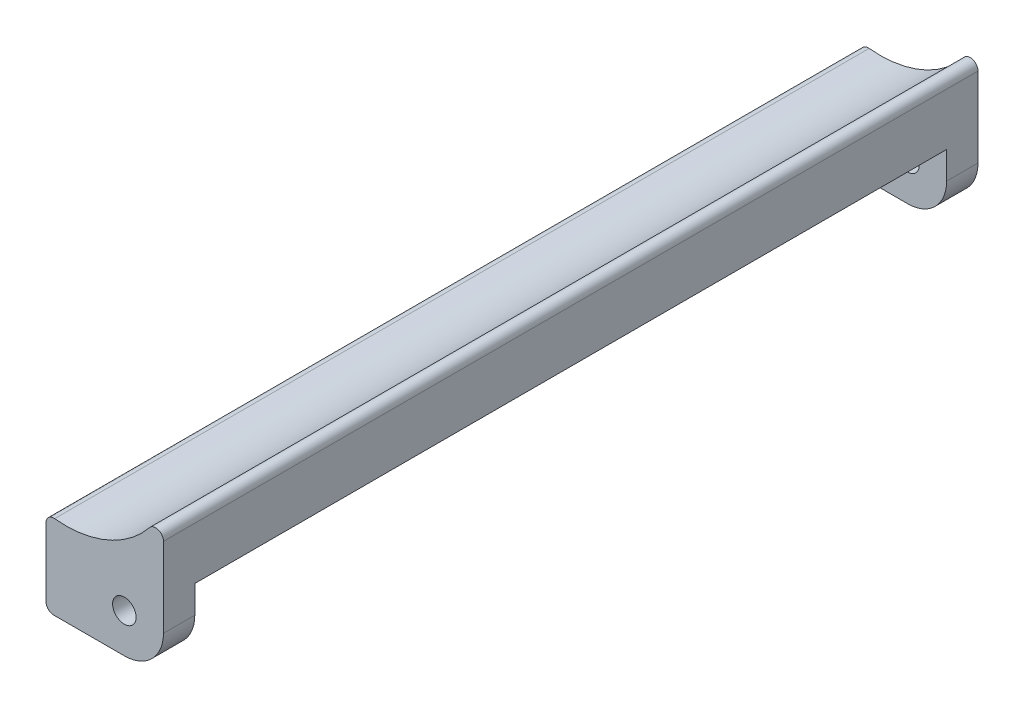
ISO-10303-21;
HEADER;
FILE_DESCRIPTION(('STEP AP214'),'2;1');
FILE_NAME('part.step','',(''),(''),'','','');
FILE_SCHEMA(('AUTOMOTIVE_DESIGN { 1 0 10303 214 1 1 1 1 }'));
ENDSEC;
DATA;
#1=APPLICATION_CONTEXT('core data for automotive mechanical design processes');
#2=APPLICATION_PROTOCOL_DEFINITION('international standard','automotive_design',2000,#1);
#3=PRODUCT_CONTEXT('',#1,'mechanical');
#4=PRODUCT('Part','Part','',(#3));
#5=PRODUCT_RELATED_PRODUCT_CATEGORY('part','',(#4));
#6=PRODUCT_DEFINITION_FORMATION('','',#4);
#7=PRODUCT_DEFINITION_CONTEXT('part definition',#1,'design');
#8=PRODUCT_DEFINITION('design','',#6,#7);
#9=PRODUCT_DEFINITION_SHAPE('','',#8);
#10=(LENGTH_UNIT() NAMED_UNIT(*) SI_UNIT(.MILLI.,.METRE.));
#11=(NAMED_UNIT(*) PLANE_ANGLE_UNIT() SI_UNIT($,.RADIAN.));
#12=(NAMED_UNIT(*) SI_UNIT($,.STERADIAN.) SOLID_ANGLE_UNIT());
#13=UNCERTAINTY_MEASURE_WITH_UNIT(LENGTH_MEASURE(1.E-05),#10,'distance_accuracy_value','');
#14=(GEOMETRIC_REPRESENTATION_CONTEXT(3) GLOBAL_UNCERTAINTY_ASSIGNED_CONTEXT((#13)) GLOBAL_UNIT_ASSIGNED_CONTEXT((#10,
#11,#12)) REPRESENTATION_CONTEXT('',''));
#15=CARTESIAN_POINT('',(0.,0.,0.));
#16=DIRECTION('',(0.,0.,1.));
#17=DIRECTION('',(1.,0.,0.));
#18=AXIS2_PLACEMENT_3D('',#15,#16,#17);
#19=CARTESIAN_POINT('',(12.75,-14.,104.));
#20=DIRECTION('',(0.,0.,-1.));
#21=DIRECTION('',(-1.,0.,0.));
#22=AXIS2_PLACEMENT_3D('',#19,#20,#21);
#23=CYLINDRICAL_SURFACE('',#22,3.5);
#24=DIRECTION('',(0.,0.,-1.));
#25=VECTOR('',#24,1.);
#26=CARTESIAN_POINT('',(12.75,-10.5,104.));
#27=LINE('',#26,#25);
#28=CARTESIAN_POINT('',(12.75,-10.5,100.));
#29=VERTEX_POINT('',#28);
#30=CARTESIAN_POINT('',(12.75,-10.5,4.));
#31=VERTEX_POINT('',#30);
#32=EDGE_CURVE('E281',#29,#31,#27,.T.);
#33=ORIENTED_EDGE('',*,*,#32,.F.);
#34=CARTESIAN_POINT('',(12.75,-14.,100.));
#35=DIRECTION('',(0.,0.,1.));
#36=DIRECTION('',(1.,0.,0.));
#37=AXIS2_PLACEMENT_3D('',#34,#35,#36);
#38=CIRCLE('',#37,3.5);
#39=CARTESIAN_POINT('',(9.25000000000001,-14.,100.));
#40=VERTEX_POINT('',#39);
#41=EDGE_CURVE('E192',#29,#40,#38,.T.);
#42=ORIENTED_EDGE('',*,*,#41,.T.);
#43=DIRECTION('',(0.,0.,-1.));
#44=VECTOR('',#43,1.);
#45=CARTESIAN_POINT('',(9.25000000000001,-14.,104.));
#46=LINE('',#45,#44);
#47=CARTESIAN_POINT('',(9.25000000000001,-14.,4.));
#48=VERTEX_POINT('',#47);
#49=EDGE_CURVE('E157',#40,#48,#46,.T.);
#50=ORIENTED_EDGE('',*,*,#49,.T.);
#51=CARTESIAN_POINT('',(12.75,-14.,4.));
#52=DIRECTION('',(0.,0.,1.));
#53=DIRECTION('',(1.,0.,0.));
#54=AXIS2_PLACEMENT_3D('',#51,#52,#53);
#55=CIRCLE('',#54,3.5);
#56=EDGE_CURVE('E215',#31,#48,#55,.T.);
#57=ORIENTED_EDGE('',*,*,#56,.F.);
#58=EDGE_LOOP('',(#33,#42,#50,#57));
#59=FACE_BOUND('',#58,.T.);
#60=ADVANCED_FACE('F45',(#59),#23,.F.);
#61=CARTESIAN_POINT('',(0.,-10.5,104.));
#62=DIRECTION('',(0.,1.,0.));
#63=DIRECTION('',(-1.,0.,0.));
#64=AXIS2_PLACEMENT_3D('',#61,#62,#63);
#65=PLANE('',#64);
#66=DIRECTION('',(1.,0.,0.));
#67=VECTOR('',#66,1.);
#68=CARTESIAN_POINT('',(0.,-10.5,100.));
#69=LINE('',#68,#67);
#70=CARTESIAN_POINT('',(17.75,-10.5,100.));
#71=VERTEX_POINT('',#70);
#72=EDGE_CURVE('E188',#29,#71,#69,.T.);
#73=ORIENTED_EDGE('',*,*,#72,.F.);
#74=ORIENTED_EDGE('',*,*,#32,.T.);
#75=DIRECTION('',(1.,0.,0.));
#76=VECTOR('',#75,1.);
#77=CARTESIAN_POINT('',(0.,-10.5,4.));
#78=LINE('',#77,#76);
#79=CARTESIAN_POINT('',(17.75,-10.5,4.));
#80=VERTEX_POINT('',#79);
#81=EDGE_CURVE('E210',#31,#80,#78,.T.);
#82=ORIENTED_EDGE('',*,*,#81,.T.);
#83=DIRECTION('',(0.,0.,-1.));
#84=VECTOR('',#83,1.);
#85=CARTESIAN_POINT('',(17.75,-10.5,104.));
#86=LINE('',#85,#84);
#87=EDGE_CURVE('E278',#71,#80,#86,.T.);
#88=ORIENTED_EDGE('',*,*,#87,.F.);
#89=EDGE_LOOP('',(#73,#74,#82,#88));
#90=FACE_BOUND('',#89,.T.);
#91=ADVANCED_FACE('F363',(#90),#65,.F.);
#92=CARTESIAN_POINT('',(9.25000000000001,0.,104.));
#93=DIRECTION('',(1.,0.,0.));
#94=DIRECTION('',(0.,0.,-1.));
#95=AXIS2_PLACEMENT_3D('',#92,#93,#94);
#96=PLANE('',#95);
#97=ORIENTED_EDGE('',*,*,#49,.F.);
#98=DIRECTION('',(0.,-1.,0.));
#99=VECTOR('',#98,1.);
#100=CARTESIAN_POINT('',(9.25000000000001,0.,100.));
#101=LINE('',#100,#99);
#102=CARTESIAN_POINT('',(9.25000000000001,-19.,100.));
#103=VERTEX_POINT('',#102);
#104=EDGE_CURVE('E195',#40,#103,#101,.T.);
#105=ORIENTED_EDGE('',*,*,#104,.T.);
#106=DIRECTION('',(0.,0.,-1.));
#107=VECTOR('',#106,1.);
#108=CARTESIAN_POINT('',(9.25000000000001,-19.,104.));
#109=LINE('',#108,#107);
#110=CARTESIAN_POINT('',(9.25000000000001,-19.,4.));
#111=VERTEX_POINT('',#110);
#112=EDGE_CURVE('E275',#103,#111,#109,.T.);
#113=ORIENTED_EDGE('',*,*,#112,.T.);
#114=DIRECTION('',(0.,-1.,0.));
#115=VECTOR('',#114,1.);
#116=CARTESIAN_POINT('',(9.25000000000001,0.,4.));
#117=LINE('',#116,#115);
#118=EDGE_CURVE('E219',#48,#111,#117,.T.);
#119=ORIENTED_EDGE('',*,*,#118,.F.);
#120=EDGE_LOOP('',(#97,#105,#113,#119));
#121=FACE_BOUND('',#120,.T.);
#122=ADVANCED_FACE('F334',(#121),#96,.T.);
#123=CARTESIAN_POINT('',(17.75,0.,104.));
#124=DIRECTION('',(1.,0.,0.));
#125=DIRECTION('',(0.,1.,0.));
#126=AXIS2_PLACEMENT_3D('',#123,#124,#125);
#127=PLANE('',#126);
#128=DIRECTION('',(0.,-1.,0.));
#129=VECTOR('',#128,1.);
#130=CARTESIAN_POINT('',(17.75,0.,0.));
#131=LINE('',#130,#129);
#132=CARTESIAN_POINT('',(17.75,-3.83647660095558,0.));
#133=VERTEX_POINT('',#132);
#134=CARTESIAN_POINT('',(17.75,-14.,0.));
#135=VERTEX_POINT('',#134);
#136=EDGE_CURVE('E248',#133,#135,#131,.T.);
#137=ORIENTED_EDGE('',*,*,#136,.F.);
#138=DIRECTION('',(0.,0.,-1.));
#139=VECTOR('',#138,1.);
#140=CARTESIAN_POINT('',(17.75,-3.83647660095558,104.));
#141=LINE('',#140,#139);
#142=CARTESIAN_POINT('',(17.75,-3.83647660095558,104.));
#143=VERTEX_POINT('',#142);
#144=EDGE_CURVE('E11',#133,#143,#141,.F.);
#145=ORIENTED_EDGE('',*,*,#144,.T.);
#146=DIRECTION('',(0.,-1.,0.));
#147=VECTOR('',#146,1.);
#148=CARTESIAN_POINT('',(17.75,0.,104.));
#149=LINE('',#148,#147);
#150=CARTESIAN_POINT('',(17.75,-14.,104.));
#151=VERTEX_POINT('',#150);
#152=EDGE_CURVE('E249',#143,#151,#149,.T.);
#153=ORIENTED_EDGE('',*,*,#152,.T.);
#154=DIRECTION('',(0.,0.,-1.));
#155=VECTOR('',#154,1.);
#156=CARTESIAN_POINT('',(17.75,-14.,104.));
#157=LINE('',#156,#155);
#158=CARTESIAN_POINT('',(17.75,-14.,100.));
#159=VERTEX_POINT('',#158);
#160=EDGE_CURVE('E171',#151,#159,#157,.T.);
#161=ORIENTED_EDGE('',*,*,#160,.T.);
#162=DIRECTION('',(0.,-1.,0.));
#163=VECTOR('',#162,1.);
#164=CARTESIAN_POINT('',(17.75,0.,100.));
#165=LINE('',#164,#163);
#166=EDGE_CURVE('E181',#71,#159,#165,.T.);
#167=ORIENTED_EDGE('',*,*,#166,.F.);
#168=ORIENTED_EDGE('',*,*,#87,.T.);
#169=DIRECTION('',(0.,-1.,0.));
#170=VECTOR('',#169,1.);
#171=CARTESIAN_POINT('',(17.75,0.,4.));
#172=LINE('',#171,#170);
#173=CARTESIAN_POINT('',(17.75,-14.,4.));
#174=VERTEX_POINT('',#173);
#175=EDGE_CURVE('E230',#80,#174,#172,.T.);
#176=ORIENTED_EDGE('',*,*,#175,.T.);
#177=DIRECTION('',(0.,0.,-1.));
#178=VECTOR('',#177,1.);
#179=CARTESIAN_POINT('',(17.75,-14.,4.));
#180=LINE('',#179,#178);
#181=EDGE_CURVE('E234',#174,#135,#180,.T.);
#182=ORIENTED_EDGE('',*,*,#181,.T.);
#183=EDGE_LOOP('',(#137,#145,#153,#161,#167,#168,#176,#182));
#184=FACE_BOUND('',#183,.T.);
#185=ADVANCED_FACE('F340',(#184),#127,.T.);
#186=CARTESIAN_POINT('',(5.25,5.4,104.));
#187=DIRECTION('',(0.,0.,-1.));
#188=DIRECTION('',(-1.,0.,0.));
#189=AXIS2_PLACEMENT_3D('',#186,#187,#188);
#190=CYLINDRICAL_SURFACE('',#189,13.75);
#191=CARTESIAN_POINT('',(5.25,5.4,0.));
#192=DIRECTION('',(0.,0.,1.));
#193=DIRECTION('',(1.,0.,0.));
#194=AXIS2_PLACEMENT_3D('',#191,#192,#193);
#195=CIRCLE('',#194,13.75);
#196=CARTESIAN_POINT('',(3.85169491525424,-8.27871495755264,0.));
#197=VERTEX_POINT('',#196);
#198=CARTESIAN_POINT('',(15.9703389830508,-3.21027479750097,0.));
#199=VERTEX_POINT('',#198);
#200=EDGE_CURVE('E262',#197,#199,#195,.T.);
#201=ORIENTED_EDGE('',*,*,#200,.F.);
#202=DIRECTION('',(0.,0.,-1.));
#203=VECTOR('',#202,1.);
#204=CARTESIAN_POINT('',(3.85169491525424,-8.27871495755264,104.));
#205=LINE('',#204,#203);
#206=CARTESIAN_POINT('',(3.85169491525424,-8.27871495755264,104.));
#207=VERTEX_POINT('',#206);
#208=EDGE_CURVE('E304',#197,#207,#205,.F.);
#209=ORIENTED_EDGE('',*,*,#208,.T.);
#210=CARTESIAN_POINT('',(5.25,5.4,104.));
#211=DIRECTION('',(0.,0.,1.));
#212=DIRECTION('',(1.,0.,0.));
#213=AXIS2_PLACEMENT_3D('',#210,#211,#212);
#214=CIRCLE('',#213,13.75);
#215=CARTESIAN_POINT('',(15.9703389830508,-3.21027479750097,104.));
#216=VERTEX_POINT('',#215);
#217=EDGE_CURVE('E252',#207,#216,#214,.T.);
#218=ORIENTED_EDGE('',*,*,#217,.T.);
#219=DIRECTION('',(0.,0.,-1.));
#220=VECTOR('',#219,1.);
#221=CARTESIAN_POINT('',(15.9703389830508,-3.21027479750097,104.));
#222=LINE('',#221,#220);
#223=EDGE_CURVE('E300',#216,#199,#222,.T.);
#224=ORIENTED_EDGE('',*,*,#223,.T.);
#225=EDGE_LOOP('',(#201,#209,#218,#224));
#226=FACE_BOUND('',#225,.T.);
#227=ADVANCED_FACE('F346',(#226),#190,.F.);
#228=CARTESIAN_POINT('',(2.75,0.,104.));
#229=DIRECTION('',(-1.,0.,0.));
#230=DIRECTION('',(0.,0.,1.));
#231=AXIS2_PLACEMENT_3D('',#228,#229,#230);
#232=PLANE('',#231);
#233=DIRECTION('',(0.,1.,0.));
#234=VECTOR('',#233,1.);
#235=CARTESIAN_POINT('',(2.75,0.,104.));
#236=LINE('',#235,#234);
#237=CARTESIAN_POINT('',(2.75,-18.,104.));
#238=VERTEX_POINT('',#237);
#239=CARTESIAN_POINT('',(2.75,-9.27353059082919,104.));
#240=VERTEX_POINT('',#239);
#241=EDGE_CURVE('E158',#238,#240,#236,.T.);
#242=ORIENTED_EDGE('',*,*,#241,.T.);
#243=DIRECTION('',(0.,0.,-1.));
#244=VECTOR('',#243,1.);
#245=CARTESIAN_POINT('',(2.75,-9.27353059082919,104.));
#246=LINE('',#245,#244);
#247=CARTESIAN_POINT('',(2.75,-9.27353059082919,0.));
#248=VERTEX_POINT('',#247);
#249=EDGE_CURVE('E287',#240,#248,#246,.T.);
#250=ORIENTED_EDGE('',*,*,#249,.T.);
#251=DIRECTION('',(0.,1.,0.));
#252=VECTOR('',#251,1.);
#253=CARTESIAN_POINT('',(2.75,0.,0.));
#254=LINE('',#253,#252);
#255=CARTESIAN_POINT('',(2.75,-18.,0.));
#256=VERTEX_POINT('',#255);
#257=EDGE_CURVE('E266',#256,#248,#254,.T.);
#258=ORIENTED_EDGE('',*,*,#257,.F.);
#259=DIRECTION('',(0.,0.,-1.));
#260=VECTOR('',#259,1.);
#261=CARTESIAN_POINT('',(2.75,-18.,104.));
#262=LINE('',#261,#260);
#263=EDGE_CURVE('E284',#256,#238,#262,.F.);
#264=ORIENTED_EDGE('',*,*,#263,.T.);
#265=EDGE_LOOP('',(#242,#250,#258,#264));
#266=FACE_BOUND('',#265,.T.);
#267=ADVANCED_FACE('F353',(#266),#232,.T.);
#268=CARTESIAN_POINT('',(0.,-19.,104.));
#269=DIRECTION('',(0.,-1.,0.));
#270=DIRECTION('',(1.,0.,0.));
#271=AXIS2_PLACEMENT_3D('',#268,#269,#270);
#272=PLANE('',#271);
#273=DIRECTION('',(-1.,0.,0.));
#274=VECTOR('',#273,1.);
#275=CARTESIAN_POINT('',(0.,-19.,104.));
#276=LINE('',#275,#274);
#277=CARTESIAN_POINT('',(12.75,-19.,104.));
#278=VERTEX_POINT('',#277);
#279=CARTESIAN_POINT('',(3.75,-19.,104.));
#280=VERTEX_POINT('',#279);
#281=EDGE_CURVE('E145',#278,#280,#276,.T.);
#282=ORIENTED_EDGE('',*,*,#281,.T.);
#283=DIRECTION('',(0.,0.,-1.));
#284=VECTOR('',#283,1.);
#285=CARTESIAN_POINT('',(3.75,-19.,104.));
#286=LINE('',#285,#284);
#287=CARTESIAN_POINT('',(3.75,-19.,0.));
#288=VERTEX_POINT('',#287);
#289=EDGE_CURVE('E54',#280,#288,#286,.T.);
#290=ORIENTED_EDGE('',*,*,#289,.T.);
#291=DIRECTION('',(-1.,0.,0.));
#292=VECTOR('',#291,1.);
#293=CARTESIAN_POINT('',(0.,-19.,0.));
#294=LINE('',#293,#292);
#295=CARTESIAN_POINT('',(12.75,-19.,0.));
#296=VERTEX_POINT('',#295);
#297=EDGE_CURVE('E253',#296,#288,#294,.T.);
#298=ORIENTED_EDGE('',*,*,#297,.F.);
#299=DIRECTION('',(0.,0.,-1.));
#300=VECTOR('',#299,1.);
#301=CARTESIAN_POINT('',(12.75,-19.,4.));
#302=LINE('',#301,#300);
#303=CARTESIAN_POINT('',(12.75,-19.,4.));
#304=VERTEX_POINT('',#303);
#305=EDGE_CURVE('E244',#304,#296,#302,.T.);
#306=ORIENTED_EDGE('',*,*,#305,.F.);
#307=DIRECTION('',(-1.,0.,0.));
#308=VECTOR('',#307,1.);
#309=CARTESIAN_POINT('',(0.,-19.,4.));
#310=LINE('',#309,#308);
#311=EDGE_CURVE('E223',#304,#111,#310,.T.);
#312=ORIENTED_EDGE('',*,*,#311,.T.);
#313=ORIENTED_EDGE('',*,*,#112,.F.);
#314=DIRECTION('',(-1.,0.,0.));
#315=VECTOR('',#314,1.);
#316=CARTESIAN_POINT('',(0.,-19.,100.));
#317=LINE('',#316,#315);
#318=CARTESIAN_POINT('',(12.75,-19.,100.));
#319=VERTEX_POINT('',#318);
#320=EDGE_CURVE('E165',#319,#103,#317,.T.);
#321=ORIENTED_EDGE('',*,*,#320,.F.);
#322=DIRECTION('',(0.,0.,-1.));
#323=VECTOR('',#322,1.);
#324=CARTESIAN_POINT('',(12.75,-19.,104.));
#325=LINE('',#324,#323);
#326=EDGE_CURVE('E161',#278,#319,#325,.T.);
#327=ORIENTED_EDGE('',*,*,#326,.F.);
#328=EDGE_LOOP('',(#282,#290,#298,#306,#312,#313,#321,#327));
#329=FACE_BOUND('',#328,.T.);
#330=ADVANCED_FACE('F162',(#329),#272,.T.);
#331=CARTESIAN_POINT('',(0.,0.,104.));
#332=DIRECTION('',(0.,0.,1.));
#333=DIRECTION('',(1.,0.,0.));
#334=AXIS2_PLACEMENT_3D('',#331,#332,#333);
#335=PLANE('',#334);
#336=ORIENTED_EDGE('',*,*,#217,.F.);
#337=CARTESIAN_POINT('',(3.75,-9.27353059082919,104.));
#338=DIRECTION('',(0.,0.,1.));
#339=DIRECTION('',(1.,0.,0.));
#340=AXIS2_PLACEMENT_3D('',#337,#338,#339);
#341=CIRCLE('',#340,1.);
#342=EDGE_CURVE('E312',#207,#240,#341,.T.);
#343=ORIENTED_EDGE('',*,*,#342,.T.);
#344=ORIENTED_EDGE('',*,*,#241,.F.);
#345=CARTESIAN_POINT('',(3.75,-18.,104.));
#346=DIRECTION('',(0.,0.,1.));
#347=DIRECTION('',(1.,0.,0.));
#348=AXIS2_PLACEMENT_3D('',#345,#346,#347);
#349=CIRCLE('',#348,1.);
#350=EDGE_CURVE('E61',#238,#280,#349,.T.);
#351=ORIENTED_EDGE('',*,*,#350,.T.);
#352=ORIENTED_EDGE('',*,*,#281,.F.);
#353=CARTESIAN_POINT('',(12.75,-14.,104.));
#354=DIRECTION('',(0.,0.,1.));
#355=DIRECTION('',(1.,0.,0.));
#356=AXIS2_PLACEMENT_3D('',#353,#354,#355);
#357=CIRCLE('',#356,5.);
#358=EDGE_CURVE('E151',#278,#151,#357,.T.);
#359=ORIENTED_EDGE('',*,*,#358,.T.);
#360=ORIENTED_EDGE('',*,*,#152,.F.);
#361=CARTESIAN_POINT('',(16.75,-3.83647660095558,104.));
#362=DIRECTION('',(0.,0.,1.));
#363=DIRECTION('',(1.,0.,0.));
#364=AXIS2_PLACEMENT_3D('',#361,#362,#363);
#365=CIRCLE('',#364,1.);
#366=EDGE_CURVE('E307',#143,#216,#365,.T.);
#367=ORIENTED_EDGE('',*,*,#366,.T.);
#368=EDGE_LOOP('',(#336,#343,#344,#351,#352,#359,#360,#367));
#369=FACE_BOUND('',#368,.T.);
#370=CARTESIAN_POINT('',(12.75,-14.,104.));
#371=DIRECTION('',(0.,0.,1.));
#372=DIRECTION('',(1.,0.,0.));
#373=AXIS2_PLACEMENT_3D('',#370,#371,#372);
#374=CIRCLE('',#373,1.5);
#375=CARTESIAN_POINT('',(14.25,-14.,104.));
#376=VERTEX_POINT('',#375);
#377=EDGE_CURVE('E175',#376,#376,#374,.T.);
#378=ORIENTED_EDGE('',*,*,#377,.F.);
#379=EDGE_LOOP('',(#378));
#380=FACE_BOUND('',#379,.T.);
#381=ADVANCED_FACE('F148',(#369,#380),#335,.T.);
#382=CARTESIAN_POINT('',(0.,0.,0.));
#383=DIRECTION('',(0.,0.,1.));
#384=DIRECTION('',(1.,0.,0.));
#385=AXIS2_PLACEMENT_3D('',#382,#383,#384);
#386=PLANE('',#385);
#387=ORIENTED_EDGE('',*,*,#257,.T.);
#388=CARTESIAN_POINT('',(3.75,-9.27353059082919,0.));
#389=DIRECTION('',(0.,0.,1.));
#390=DIRECTION('',(1.,0.,0.));
#391=AXIS2_PLACEMENT_3D('',#388,#389,#390);
#392=CIRCLE('',#391,1.);
#393=EDGE_CURVE('E297',#248,#197,#392,.F.);
#394=ORIENTED_EDGE('',*,*,#393,.T.);
#395=ORIENTED_EDGE('',*,*,#200,.T.);
#396=CARTESIAN_POINT('',(16.75,-3.83647660095558,0.));
#397=DIRECTION('',(0.,0.,1.));
#398=DIRECTION('',(1.,0.,0.));
#399=AXIS2_PLACEMENT_3D('',#396,#397,#398);
#400=CIRCLE('',#399,1.);
#401=EDGE_CURVE('E291',#199,#133,#400,.F.);
#402=ORIENTED_EDGE('',*,*,#401,.T.);
#403=ORIENTED_EDGE('',*,*,#136,.T.);
#404=CARTESIAN_POINT('',(12.75,-14.,0.));
#405=DIRECTION('',(0.,0.,1.));
#406=DIRECTION('',(1.,0.,0.));
#407=AXIS2_PLACEMENT_3D('',#404,#405,#406);
#408=CIRCLE('',#407,5.);
#409=EDGE_CURVE('E211',#296,#135,#408,.T.);
#410=ORIENTED_EDGE('',*,*,#409,.F.);
#411=ORIENTED_EDGE('',*,*,#297,.T.);
#412=CARTESIAN_POINT('',(3.75,-18.,0.));
#413=DIRECTION('',(0.,0.,1.));
#414=DIRECTION('',(1.,0.,0.));
#415=AXIS2_PLACEMENT_3D('',#412,#413,#414);
#416=CIRCLE('',#415,1.);
#417=EDGE_CURVE('E294',#288,#256,#416,.F.);
#418=ORIENTED_EDGE('',*,*,#417,.T.);
#419=EDGE_LOOP('',(#387,#394,#395,#402,#403,#410,#411,#418));
#420=FACE_BOUND('',#419,.T.);
#421=CARTESIAN_POINT('',(12.75,-14.,0.));
#422=DIRECTION('',(0.,0.,1.));
#423=DIRECTION('',(1.,0.,0.));
#424=AXIS2_PLACEMENT_3D('',#421,#422,#423);
#425=CIRCLE('',#424,1.5);
#426=CARTESIAN_POINT('',(14.25,-14.,0.));
#427=VERTEX_POINT('',#426);
#428=EDGE_CURVE('E170',#427,#427,#425,.T.);
#429=ORIENTED_EDGE('',*,*,#428,.T.);
#430=EDGE_LOOP('',(#429));
#431=FACE_BOUND('',#430,.T.);
#432=ADVANCED_FACE('F318',(#420,#431),#386,.F.);
#433=CARTESIAN_POINT('',(12.75,-14.,4.));
#434=DIRECTION('',(0.,0.,-1.));
#435=DIRECTION('',(-1.,0.,0.));
#436=AXIS2_PLACEMENT_3D('',#433,#434,#435);
#437=CYLINDRICAL_SURFACE('',#436,5.);
#438=ORIENTED_EDGE('',*,*,#409,.T.);
#439=ORIENTED_EDGE('',*,*,#181,.F.);
#440=CARTESIAN_POINT('',(12.75,-14.,4.));
#441=DIRECTION('',(0.,0.,1.));
#442=DIRECTION('',(1.,0.,0.));
#443=AXIS2_PLACEMENT_3D('',#440,#441,#442);
#444=CIRCLE('',#443,5.);
#445=EDGE_CURVE('E227',#304,#174,#444,.T.);
#446=ORIENTED_EDGE('',*,*,#445,.F.);
#447=ORIENTED_EDGE('',*,*,#305,.T.);
#448=EDGE_LOOP('',(#438,#439,#446,#447));
#449=FACE_BOUND('',#448,.T.);
#450=ADVANCED_FACE('F323',(#449),#437,.T.);
#451=CARTESIAN_POINT('',(12.75,-14.,4.));
#452=DIRECTION('',(0.,0.,-1.));
#453=DIRECTION('',(-1.,0.,0.));
#454=AXIS2_PLACEMENT_3D('',#451,#452,#453);
#455=CYLINDRICAL_SURFACE('',#454,1.5);
#456=CARTESIAN_POINT('',(12.75,-14.,4.));
#457=DIRECTION('',(0.,0.,1.));
#458=DIRECTION('',(1.,0.,0.));
#459=AXIS2_PLACEMENT_3D('',#456,#457,#458);
#460=CIRCLE('',#459,1.5);
#461=CARTESIAN_POINT('',(14.25,-14.,4.));
#462=VERTEX_POINT('',#461);
#463=EDGE_CURVE('E206',#462,#462,#460,.T.);
#464=ORIENTED_EDGE('',*,*,#463,.T.);
#465=EDGE_LOOP('',(#464));
#466=FACE_BOUND('',#465,.T.);
#467=ORIENTED_EDGE('',*,*,#428,.F.);
#468=EDGE_LOOP('',(#467));
#469=FACE_BOUND('',#468,.T.);
#470=ADVANCED_FACE('F388',(#466,#469),#455,.F.);
#471=CARTESIAN_POINT('',(0.,0.,4.));
#472=DIRECTION('',(0.,0.,1.));
#473=DIRECTION('',(1.,0.,0.));
#474=AXIS2_PLACEMENT_3D('',#471,#472,#473);
#475=PLANE('',#474);
#476=ORIENTED_EDGE('',*,*,#463,.F.);
#477=EDGE_LOOP('',(#476));
#478=FACE_BOUND('',#477,.T.);
#479=ORIENTED_EDGE('',*,*,#81,.F.);
#480=ORIENTED_EDGE('',*,*,#56,.T.);
#481=ORIENTED_EDGE('',*,*,#118,.T.);
#482=ORIENTED_EDGE('',*,*,#311,.F.);
#483=ORIENTED_EDGE('',*,*,#445,.T.);
#484=ORIENTED_EDGE('',*,*,#175,.F.);
#485=EDGE_LOOP('',(#479,#480,#481,#482,#483,#484));
#486=FACE_BOUND('',#485,.T.);
#487=ADVANCED_FACE('F328',(#478,#486),#475,.T.);
#488=CARTESIAN_POINT('',(12.75,-14.,104.));
#489=DIRECTION('',(0.,0.,-1.));
#490=DIRECTION('',(-1.,0.,0.));
#491=AXIS2_PLACEMENT_3D('',#488,#489,#490);
#492=CYLINDRICAL_SURFACE('',#491,5.);
#493=CARTESIAN_POINT('',(12.75,-14.,100.));
#494=DIRECTION('',(0.,0.,1.));
#495=DIRECTION('',(1.,0.,0.));
#496=AXIS2_PLACEMENT_3D('',#493,#494,#495);
#497=CIRCLE('',#496,5.);
#498=EDGE_CURVE('E200',#319,#159,#497,.T.);
#499=ORIENTED_EDGE('',*,*,#498,.T.);
#500=ORIENTED_EDGE('',*,*,#160,.F.);
#501=ORIENTED_EDGE('',*,*,#358,.F.);
#502=ORIENTED_EDGE('',*,*,#326,.T.);
#503=EDGE_LOOP('',(#499,#500,#501,#502));
#504=FACE_BOUND('',#503,.T.);
#505=ADVANCED_FACE('F173',(#504),#492,.T.);
#506=CARTESIAN_POINT('',(12.75,-14.,104.));
#507=DIRECTION('',(0.,0.,-1.));
#508=DIRECTION('',(-1.,0.,0.));
#509=AXIS2_PLACEMENT_3D('',#506,#507,#508);
#510=CYLINDRICAL_SURFACE('',#509,1.5);
#511=ORIENTED_EDGE('',*,*,#377,.T.);
#512=EDGE_LOOP('',(#511));
#513=FACE_BOUND('',#512,.T.);
#514=CARTESIAN_POINT('',(12.75,-14.,100.));
#515=DIRECTION('',(0.,0.,1.));
#516=DIRECTION('',(1.,0.,0.));
#517=AXIS2_PLACEMENT_3D('',#514,#515,#516);
#518=CIRCLE('',#517,1.5);
#519=CARTESIAN_POINT('',(14.25,-14.,100.));
#520=VERTEX_POINT('',#519);
#521=EDGE_CURVE('E184',#520,#520,#518,.T.);
#522=ORIENTED_EDGE('',*,*,#521,.F.);
#523=EDGE_LOOP('',(#522));
#524=FACE_BOUND('',#523,.T.);
#525=ADVANCED_FACE('F396',(#513,#524),#510,.F.);
#526=CARTESIAN_POINT('',(0.,0.,100.));
#527=DIRECTION('',(0.,0.,1.));
#528=DIRECTION('',(1.,0.,0.));
#529=AXIS2_PLACEMENT_3D('',#526,#527,#528);
#530=PLANE('',#529);
#531=ORIENTED_EDGE('',*,*,#521,.T.);
#532=EDGE_LOOP('',(#531));
#533=FACE_BOUND('',#532,.T.);
#534=ORIENTED_EDGE('',*,*,#72,.T.);
#535=ORIENTED_EDGE('',*,*,#166,.T.);
#536=ORIENTED_EDGE('',*,*,#498,.F.);
#537=ORIENTED_EDGE('',*,*,#320,.T.);
#538=ORIENTED_EDGE('',*,*,#104,.F.);
#539=ORIENTED_EDGE('',*,*,#41,.F.);
#540=EDGE_LOOP('',(#534,#535,#536,#537,#538,#539));
#541=FACE_BOUND('',#540,.T.);
#542=ADVANCED_FACE('F338',(#533,#541),#530,.F.);
#543=CARTESIAN_POINT('',(3.75,-9.27353059082919,104.));
#544=DIRECTION('',(0.,0.,-1.));
#545=DIRECTION('',(-1.,0.,0.));
#546=AXIS2_PLACEMENT_3D('',#543,#544,#545);
#547=CYLINDRICAL_SURFACE('',#546,1.);
#548=ORIENTED_EDGE('',*,*,#342,.F.);
#549=ORIENTED_EDGE('',*,*,#208,.F.);
#550=ORIENTED_EDGE('',*,*,#393,.F.);
#551=ORIENTED_EDGE('',*,*,#249,.F.);
#552=EDGE_LOOP('',(#548,#549,#550,#551));
#553=FACE_BOUND('',#552,.T.);
#554=ADVANCED_FACE('F351',(#553),#547,.T.);
#555=CARTESIAN_POINT('',(3.75,-18.,104.));
#556=DIRECTION('',(0.,0.,-1.));
#557=DIRECTION('',(-1.,0.,0.));
#558=AXIS2_PLACEMENT_3D('',#555,#556,#557);
#559=CYLINDRICAL_SURFACE('',#558,1.);
#560=ORIENTED_EDGE('',*,*,#350,.F.);
#561=ORIENTED_EDGE('',*,*,#263,.F.);
#562=ORIENTED_EDGE('',*,*,#417,.F.);
#563=ORIENTED_EDGE('',*,*,#289,.F.);
#564=EDGE_LOOP('',(#560,#561,#562,#563));
#565=FACE_BOUND('',#564,.T.);
#566=ADVANCED_FACE('F355',(#565),#559,.T.);
#567=CARTESIAN_POINT('',(16.75,-3.83647660095558,104.));
#568=DIRECTION('',(0.,0.,-1.));
#569=DIRECTION('',(-1.,0.,0.));
#570=AXIS2_PLACEMENT_3D('',#567,#568,#569);
#571=CYLINDRICAL_SURFACE('',#570,1.);
#572=ORIENTED_EDGE('',*,*,#366,.F.);
#573=ORIENTED_EDGE('',*,*,#144,.F.);
#574=ORIENTED_EDGE('',*,*,#401,.F.);
#575=ORIENTED_EDGE('',*,*,#223,.F.);
#576=EDGE_LOOP('',(#572,#573,#574,#575));
#577=FACE_BOUND('',#576,.T.);
#578=ADVANCED_FACE('F47',(#577),#571,.T.);
#579=CLOSED_SHELL('',(#60,#91,#122,#185,#227,#267,#330,#381,#432,#450,#470,#487,#505,#525,#542,
#554,#566,#578));
#580=MANIFOLD_SOLID_BREP('B2',#579);
#581=ADVANCED_BREP_SHAPE_REPRESENTATION('',(#18,#580),#14);
#582=SHAPE_DEFINITION_REPRESENTATION(#9,#581);
ENDSEC;
END-ISO-10303-21;
